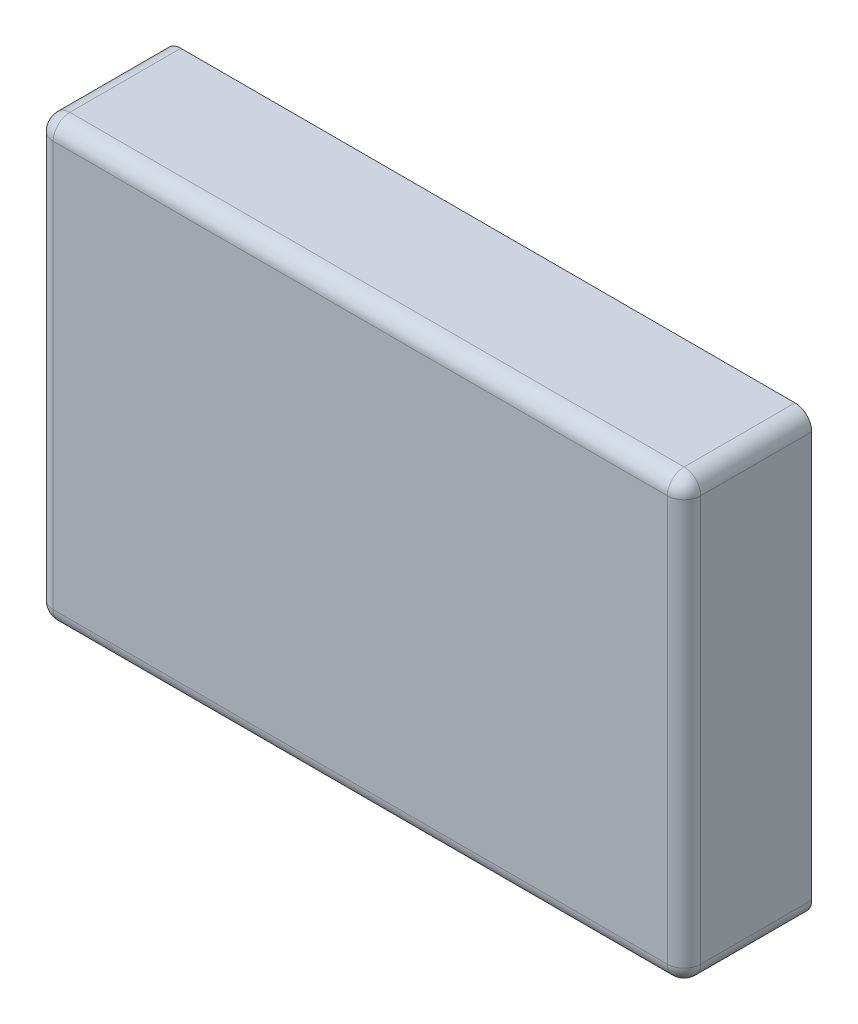
ISO-10303-21;
HEADER;
FILE_DESCRIPTION(('STEP AP214'),'2;1');
FILE_NAME('part.step','',(''),(''),'','','');
FILE_SCHEMA(('AUTOMOTIVE_DESIGN { 1 0 10303 214 1 1 1 1 }'));
ENDSEC;
DATA;
#1=APPLICATION_CONTEXT('core data for automotive mechanical design processes');
#2=APPLICATION_PROTOCOL_DEFINITION('international standard','automotive_design',2000,#1);
#3=PRODUCT_CONTEXT('',#1,'mechanical');
#4=PRODUCT('Part','Part','',(#3));
#5=PRODUCT_RELATED_PRODUCT_CATEGORY('part','',(#4));
#6=PRODUCT_DEFINITION_FORMATION('','',#4);
#7=PRODUCT_DEFINITION_CONTEXT('part definition',#1,'design');
#8=PRODUCT_DEFINITION('design','',#6,#7);
#9=PRODUCT_DEFINITION_SHAPE('','',#8);
#10=(LENGTH_UNIT() NAMED_UNIT(*) SI_UNIT(.MILLI.,.METRE.));
#11=(NAMED_UNIT(*) PLANE_ANGLE_UNIT() SI_UNIT($,.RADIAN.));
#12=(NAMED_UNIT(*) SI_UNIT($,.STERADIAN.) SOLID_ANGLE_UNIT());
#13=UNCERTAINTY_MEASURE_WITH_UNIT(LENGTH_MEASURE(1.E-05),#10,'distance_accuracy_value','');
#14=(GEOMETRIC_REPRESENTATION_CONTEXT(3) GLOBAL_UNCERTAINTY_ASSIGNED_CONTEXT((#13)) GLOBAL_UNIT_ASSIGNED_CONTEXT((#10,
#11,#12)) REPRESENTATION_CONTEXT('',''));
#15=CARTESIAN_POINT('',(0.,0.,0.));
#16=DIRECTION('',(0.,0.,1.));
#17=DIRECTION('',(1.,0.,0.));
#18=AXIS2_PLACEMENT_3D('',#15,#16,#17);
#19=CARTESIAN_POINT('',(0.,0.,9.7282));
#20=DIRECTION('',(1.,0.,0.));
#21=DIRECTION('',(0.,0.,-1.));
#22=AXIS2_PLACEMENT_3D('',#19,#20,#21);
#23=PLANE('',#22);
#24=DIRECTION('',(0.,-1.,0.));
#25=VECTOR('',#24,1.);
#26=CARTESIAN_POINT('',(0.,0.,0.));
#27=LINE('',#26,#25);
#28=CARTESIAN_POINT('',(0.,32.1818,0.));
#29=VERTEX_POINT('',#28);
#30=CARTESIAN_POINT('',(0.,1.27,0.));
#31=VERTEX_POINT('',#30);
#32=EDGE_CURVE('E198',#29,#31,#27,.T.);
#33=ORIENTED_EDGE('',*,*,#32,.T.);
#34=DIRECTION('',(0.,0.,-1.));
#35=VECTOR('',#34,1.);
#36=CARTESIAN_POINT('',(0.,1.27,9.7282));
#37=LINE('',#36,#35);
#38=CARTESIAN_POINT('',(0.,1.27,8.4582));
#39=VERTEX_POINT('',#38);
#40=EDGE_CURVE('E50',#31,#39,#37,.F.);
#41=ORIENTED_EDGE('',*,*,#40,.T.);
#42=DIRECTION('',(0.,-1.,0.));
#43=VECTOR('',#42,1.);
#44=CARTESIAN_POINT('',(0.,0.,8.4582));
#45=LINE('',#44,#43);
#46=CARTESIAN_POINT('',(0.,32.1818,8.4582));
#47=VERTEX_POINT('',#46);
#48=EDGE_CURVE('E55',#39,#47,#45,.F.);
#49=ORIENTED_EDGE('',*,*,#48,.T.);
#50=DIRECTION('',(0.,0.,-1.));
#51=VECTOR('',#50,1.);
#52=CARTESIAN_POINT('',(0.,32.1818,9.7282));
#53=LINE('',#52,#51);
#54=EDGE_CURVE('E167',#47,#29,#53,.T.);
#55=ORIENTED_EDGE('',*,*,#54,.T.);
#56=EDGE_LOOP('',(#33,#41,#49,#55));
#57=FACE_BOUND('',#56,.T.);
#58=ADVANCED_FACE('F33',(#57),#23,.F.);
#59=CARTESIAN_POINT('',(0.,0.,9.7282));
#60=DIRECTION('',(0.,1.,0.));
#61=DIRECTION('',(0.,0.,1.));
#62=AXIS2_PLACEMENT_3D('',#59,#60,#61);
#63=PLANE('',#62);
#64=DIRECTION('',(1.,0.,0.));
#65=VECTOR('',#64,1.);
#66=CARTESIAN_POINT('',(0.,0.,8.4582));
#67=LINE('',#66,#65);
#68=CARTESIAN_POINT('',(48.0822,0.,8.4582));
#69=VERTEX_POINT('',#68);
#70=CARTESIAN_POINT('',(1.27,0.,8.4582));
#71=VERTEX_POINT('',#70);
#72=EDGE_CURVE('E163',#69,#71,#67,.F.);
#73=ORIENTED_EDGE('',*,*,#72,.T.);
#74=DIRECTION('',(0.,0.,-1.));
#75=VECTOR('',#74,1.);
#76=CARTESIAN_POINT('',(1.27,0.,9.7282));
#77=LINE('',#76,#75);
#78=CARTESIAN_POINT('',(1.27,0.,0.));
#79=VERTEX_POINT('',#78);
#80=EDGE_CURVE('E165',#71,#79,#77,.T.);
#81=ORIENTED_EDGE('',*,*,#80,.T.);
#82=DIRECTION('',(1.,0.,0.));
#83=VECTOR('',#82,1.);
#84=CARTESIAN_POINT('',(0.,0.,0.));
#85=LINE('',#84,#83);
#86=CARTESIAN_POINT('',(48.0822,0.,0.));
#87=VERTEX_POINT('',#86);
#88=EDGE_CURVE('E200',#79,#87,#85,.T.);
#89=ORIENTED_EDGE('',*,*,#88,.T.);
#90=DIRECTION('',(0.,0.,-1.));
#91=VECTOR('',#90,1.);
#92=CARTESIAN_POINT('',(48.0822,0.,9.7282));
#93=LINE('',#92,#91);
#94=EDGE_CURVE('E161',#87,#69,#93,.F.);
#95=ORIENTED_EDGE('',*,*,#94,.T.);
#96=EDGE_LOOP('',(#73,#81,#89,#95));
#97=FACE_BOUND('',#96,.T.);
#98=ADVANCED_FACE('F252',(#97),#63,.F.);
#99=CARTESIAN_POINT('',(49.3522,0.,9.7282));
#100=DIRECTION('',(-1.,0.,0.));
#101=DIRECTION('',(0.,0.,1.));
#102=AXIS2_PLACEMENT_3D('',#99,#100,#101);
#103=PLANE('',#102);
#104=DIRECTION('',(0.,1.,0.));
#105=VECTOR('',#104,1.);
#106=CARTESIAN_POINT('',(49.3522,0.,8.4582));
#107=LINE('',#106,#105);
#108=CARTESIAN_POINT('',(49.3522,32.1818,8.4582));
#109=VERTEX_POINT('',#108);
#110=CARTESIAN_POINT('',(49.3522,1.27,8.4582));
#111=VERTEX_POINT('',#110);
#112=EDGE_CURVE('E157',#109,#111,#107,.F.);
#113=ORIENTED_EDGE('',*,*,#112,.T.);
#114=DIRECTION('',(0.,0.,-1.));
#115=VECTOR('',#114,1.);
#116=CARTESIAN_POINT('',(49.3522,1.27,9.7282));
#117=LINE('',#116,#115);
#118=CARTESIAN_POINT('',(49.3522,1.27,0.));
#119=VERTEX_POINT('',#118);
#120=EDGE_CURVE('E159',#111,#119,#117,.T.);
#121=ORIENTED_EDGE('',*,*,#120,.T.);
#122=DIRECTION('',(0.,1.,0.));
#123=VECTOR('',#122,1.);
#124=CARTESIAN_POINT('',(49.3522,0.,0.));
#125=LINE('',#124,#123);
#126=CARTESIAN_POINT('',(49.3522,32.1818,0.));
#127=VERTEX_POINT('',#126);
#128=EDGE_CURVE('E204',#119,#127,#125,.T.);
#129=ORIENTED_EDGE('',*,*,#128,.T.);
#130=DIRECTION('',(0.,0.,-1.));
#131=VECTOR('',#130,1.);
#132=CARTESIAN_POINT('',(49.3522,32.1818,9.7282));
#133=LINE('',#132,#131);
#134=EDGE_CURVE('E155',#127,#109,#133,.F.);
#135=ORIENTED_EDGE('',*,*,#134,.T.);
#136=EDGE_LOOP('',(#113,#121,#129,#135));
#137=FACE_BOUND('',#136,.T.);
#138=ADVANCED_FACE('F257',(#137),#103,.F.);
#139=CARTESIAN_POINT('',(0.,33.4518,9.7282));
#140=DIRECTION('',(0.,-1.,0.));
#141=DIRECTION('',(0.,0.,-1.));
#142=AXIS2_PLACEMENT_3D('',#139,#140,#141);
#143=PLANE('',#142);
#144=DIRECTION('',(-1.,0.,0.));
#145=VECTOR('',#144,1.);
#146=CARTESIAN_POINT('',(0.,33.4518,8.4582));
#147=LINE('',#146,#145);
#148=CARTESIAN_POINT('',(1.27,33.4518,8.4582));
#149=VERTEX_POINT('',#148);
#150=CARTESIAN_POINT('',(48.0822,33.4518,8.4582));
#151=VERTEX_POINT('',#150);
#152=EDGE_CURVE('E118',#149,#151,#147,.F.);
#153=ORIENTED_EDGE('',*,*,#152,.T.);
#154=DIRECTION('',(0.,0.,-1.));
#155=VECTOR('',#154,1.);
#156=CARTESIAN_POINT('',(48.0822,33.4518,9.7282));
#157=LINE('',#156,#155);
#158=CARTESIAN_POINT('',(48.0822,33.4518,0.));
#159=VERTEX_POINT('',#158);
#160=EDGE_CURVE('E153',#151,#159,#157,.T.);
#161=ORIENTED_EDGE('',*,*,#160,.T.);
#162=DIRECTION('',(-1.,0.,0.));
#163=VECTOR('',#162,1.);
#164=CARTESIAN_POINT('',(0.,33.4518,0.));
#165=LINE('',#164,#163);
#166=CARTESIAN_POINT('',(1.27,33.4518,0.));
#167=VERTEX_POINT('',#166);
#168=EDGE_CURVE('E140',#159,#167,#165,.T.);
#169=ORIENTED_EDGE('',*,*,#168,.T.);
#170=DIRECTION('',(0.,0.,-1.));
#171=VECTOR('',#170,1.);
#172=CARTESIAN_POINT('',(1.27,33.4518,9.7282));
#173=LINE('',#172,#171);
#174=EDGE_CURVE('E146',#167,#149,#173,.F.);
#175=ORIENTED_EDGE('',*,*,#174,.T.);
#176=EDGE_LOOP('',(#153,#161,#169,#175));
#177=FACE_BOUND('',#176,.T.);
#178=ADVANCED_FACE('F229',(#177),#143,.F.);
#179=CARTESIAN_POINT('',(0.,0.,9.7282));
#180=DIRECTION('',(0.,0.,-1.));
#181=DIRECTION('',(-1.,0.,0.));
#182=AXIS2_PLACEMENT_3D('',#179,#180,#181);
#183=PLANE('',#182);
#184=DIRECTION('',(0.,1.,0.));
#185=VECTOR('',#184,1.);
#186=CARTESIAN_POINT('',(48.0822,0.,9.7282));
#187=LINE('',#186,#185);
#188=CARTESIAN_POINT('',(48.0822,1.27,9.7282));
#189=VERTEX_POINT('',#188);
#190=CARTESIAN_POINT('',(48.0822,32.1818,9.7282));
#191=VERTEX_POINT('',#190);
#192=EDGE_CURVE('E144',#189,#191,#187,.T.);
#193=ORIENTED_EDGE('',*,*,#192,.T.);
#194=DIRECTION('',(-1.,0.,0.));
#195=VECTOR('',#194,1.);
#196=CARTESIAN_POINT('',(0.,32.1818,9.7282));
#197=LINE('',#196,#195);
#198=CARTESIAN_POINT('',(1.27,32.1818,9.7282));
#199=VERTEX_POINT('',#198);
#200=EDGE_CURVE('E116',#191,#199,#197,.T.);
#201=ORIENTED_EDGE('',*,*,#200,.T.);
#202=DIRECTION('',(0.,-1.,0.));
#203=VECTOR('',#202,1.);
#204=CARTESIAN_POINT('',(1.27,0.,9.7282));
#205=LINE('',#204,#203);
#206=CARTESIAN_POINT('',(1.27,1.27,9.7282));
#207=VERTEX_POINT('',#206);
#208=EDGE_CURVE('E133',#199,#207,#205,.T.);
#209=ORIENTED_EDGE('',*,*,#208,.T.);
#210=DIRECTION('',(1.,0.,0.));
#211=VECTOR('',#210,1.);
#212=CARTESIAN_POINT('',(0.,1.27,9.7282));
#213=LINE('',#212,#211);
#214=EDGE_CURVE('E139',#207,#189,#213,.T.);
#215=ORIENTED_EDGE('',*,*,#214,.T.);
#216=EDGE_LOOP('',(#193,#201,#209,#215));
#217=FACE_BOUND('',#216,.T.);
#218=ADVANCED_FACE('F142',(#217),#183,.F.);
#219=CARTESIAN_POINT('',(0.,0.,0.));
#220=DIRECTION('',(0.,0.,-1.));
#221=DIRECTION('',(-1.,0.,0.));
#222=AXIS2_PLACEMENT_3D('',#219,#220,#221);
#223=PLANE('',#222);
#224=ORIENTED_EDGE('',*,*,#88,.F.);
#225=CARTESIAN_POINT('',(1.27,1.27,0.));
#226=DIRECTION('',(0.,0.,-1.));
#227=DIRECTION('',(-1.,0.,0.));
#228=AXIS2_PLACEMENT_3D('',#225,#226,#227);
#229=CIRCLE('',#228,1.27);
#230=EDGE_CURVE('E11',#79,#31,#229,.T.);
#231=ORIENTED_EDGE('',*,*,#230,.T.);
#232=ORIENTED_EDGE('',*,*,#32,.F.);
#233=CARTESIAN_POINT('',(1.27,32.1818,0.));
#234=DIRECTION('',(0.,0.,-1.));
#235=DIRECTION('',(-1.,0.,0.));
#236=AXIS2_PLACEMENT_3D('',#233,#234,#235);
#237=CIRCLE('',#236,1.27);
#238=EDGE_CURVE('E171',#29,#167,#237,.T.);
#239=ORIENTED_EDGE('',*,*,#238,.T.);
#240=ORIENTED_EDGE('',*,*,#168,.F.);
#241=CARTESIAN_POINT('',(48.0822,32.1818,0.));
#242=DIRECTION('',(0.,0.,-1.));
#243=DIRECTION('',(-1.,0.,0.));
#244=AXIS2_PLACEMENT_3D('',#241,#242,#243);
#245=CIRCLE('',#244,1.27);
#246=EDGE_CURVE('E173',#159,#127,#245,.T.);
#247=ORIENTED_EDGE('',*,*,#246,.T.);
#248=ORIENTED_EDGE('',*,*,#128,.F.);
#249=CARTESIAN_POINT('',(48.0822,1.27,0.));
#250=DIRECTION('',(0.,0.,-1.));
#251=DIRECTION('',(-1.,0.,0.));
#252=AXIS2_PLACEMENT_3D('',#249,#250,#251);
#253=CIRCLE('',#252,1.27);
#254=EDGE_CURVE('E42',#119,#87,#253,.T.);
#255=ORIENTED_EDGE('',*,*,#254,.T.);
#256=EDGE_LOOP('',(#224,#231,#232,#239,#240,#247,#248,#255));
#257=FACE_BOUND('',#256,.T.);
#258=ADVANCED_FACE('F236',(#257),#223,.T.);
#259=CARTESIAN_POINT('',(48.0822,1.27,9.7282));
#260=DIRECTION('',(0.,0.,-1.));
#261=DIRECTION('',(-1.,0.,0.));
#262=AXIS2_PLACEMENT_3D('',#259,#260,#261);
#263=CYLINDRICAL_SURFACE('',#262,1.27);
#264=ORIENTED_EDGE('',*,*,#254,.F.);
#265=ORIENTED_EDGE('',*,*,#120,.F.);
#266=CARTESIAN_POINT('',(48.0822,1.27,8.4582));
#267=DIRECTION('',(0.,0.,1.));
#268=DIRECTION('',(1.,0.,0.));
#269=AXIS2_PLACEMENT_3D('',#266,#267,#268);
#270=CIRCLE('',#269,1.27);
#271=EDGE_CURVE('E37',#69,#111,#270,.T.);
#272=ORIENTED_EDGE('',*,*,#271,.F.);
#273=ORIENTED_EDGE('',*,*,#94,.F.);
#274=EDGE_LOOP('',(#264,#265,#272,#273));
#275=FACE_BOUND('',#274,.T.);
#276=ADVANCED_FACE('F35',(#275),#263,.T.);
#277=CARTESIAN_POINT('',(0.,1.27,8.4582));
#278=DIRECTION('',(1.,0.,0.));
#279=DIRECTION('',(0.,0.,-1.));
#280=AXIS2_PLACEMENT_3D('',#277,#278,#279);
#281=CYLINDRICAL_SURFACE('',#280,1.27);
#282=CARTESIAN_POINT('',(1.27,1.27,8.4582));
#283=DIRECTION('',(-1.,0.,0.));
#284=DIRECTION('',(0.,0.,1.));
#285=AXIS2_PLACEMENT_3D('',#282,#283,#284);
#286=CIRCLE('',#285,1.27);
#287=EDGE_CURVE('E190',#71,#207,#286,.T.);
#288=ORIENTED_EDGE('',*,*,#287,.F.);
#289=ORIENTED_EDGE('',*,*,#72,.F.);
#290=CARTESIAN_POINT('',(48.0822,1.27,8.4582));
#291=DIRECTION('',(1.,0.,0.));
#292=DIRECTION('',(0.,0.,-1.));
#293=AXIS2_PLACEMENT_3D('',#290,#291,#292);
#294=CIRCLE('',#293,1.27);
#295=EDGE_CURVE('E192',#189,#69,#294,.T.);
#296=ORIENTED_EDGE('',*,*,#295,.F.);
#297=ORIENTED_EDGE('',*,*,#214,.F.);
#298=EDGE_LOOP('',(#288,#289,#296,#297));
#299=FACE_BOUND('',#298,.T.);
#300=ADVANCED_FACE('F213',(#299),#281,.T.);
#301=CARTESIAN_POINT('',(1.27,1.27,9.7282));
#302=DIRECTION('',(0.,0.,-1.));
#303=DIRECTION('',(-1.,0.,0.));
#304=AXIS2_PLACEMENT_3D('',#301,#302,#303);
#305=CYLINDRICAL_SURFACE('',#304,1.27);
#306=ORIENTED_EDGE('',*,*,#230,.F.);
#307=ORIENTED_EDGE('',*,*,#80,.F.);
#308=CARTESIAN_POINT('',(1.27,1.27,8.4582));
#309=DIRECTION('',(0.,0.,1.));
#310=DIRECTION('',(1.,0.,0.));
#311=AXIS2_PLACEMENT_3D('',#308,#309,#310);
#312=CIRCLE('',#311,1.27);
#313=EDGE_CURVE('E187',#39,#71,#312,.T.);
#314=ORIENTED_EDGE('',*,*,#313,.F.);
#315=ORIENTED_EDGE('',*,*,#40,.F.);
#316=EDGE_LOOP('',(#306,#307,#314,#315));
#317=FACE_BOUND('',#316,.T.);
#318=ADVANCED_FACE('F240',(#317),#305,.T.);
#319=CARTESIAN_POINT('',(48.0822,1.27,8.4582));
#320=DIRECTION('',(0.,0.,1.));
#321=DIRECTION('',(1.,0.,0.));
#322=AXIS2_PLACEMENT_3D('',#319,#320,#321);
#323=SPHERICAL_SURFACE('',#322,1.27);
#324=ORIENTED_EDGE('',*,*,#295,.T.);
#325=ORIENTED_EDGE('',*,*,#271,.T.);
#326=CARTESIAN_POINT('',(48.0822,1.27,8.4582));
#327=DIRECTION('',(0.,-1.,0.));
#328=DIRECTION('',(0.,0.,-1.));
#329=AXIS2_PLACEMENT_3D('',#326,#327,#328);
#330=CIRCLE('',#329,1.27);
#331=EDGE_CURVE('E184',#189,#111,#330,.F.);
#332=ORIENTED_EDGE('',*,*,#331,.F.);
#333=EDGE_LOOP('',(#324,#325,#332));
#334=FACE_BOUND('',#333,.T.);
#335=ADVANCED_FACE('F214',(#334),#323,.T.);
#336=CARTESIAN_POINT('',(1.27,1.27,8.4582));
#337=DIRECTION('',(0.,0.,1.));
#338=DIRECTION('',(1.,0.,0.));
#339=AXIS2_PLACEMENT_3D('',#336,#337,#338);
#340=SPHERICAL_SURFACE('',#339,1.27);
#341=ORIENTED_EDGE('',*,*,#313,.T.);
#342=ORIENTED_EDGE('',*,*,#287,.T.);
#343=CARTESIAN_POINT('',(1.27,1.27,8.4582));
#344=DIRECTION('',(0.,-1.,0.));
#345=DIRECTION('',(0.,0.,-1.));
#346=AXIS2_PLACEMENT_3D('',#343,#344,#345);
#347=CIRCLE('',#346,1.27);
#348=EDGE_CURVE('E136',#39,#207,#347,.F.);
#349=ORIENTED_EDGE('',*,*,#348,.F.);
#350=EDGE_LOOP('',(#341,#342,#349));
#351=FACE_BOUND('',#350,.T.);
#352=ADVANCED_FACE('F242',(#351),#340,.T.);
#353=CARTESIAN_POINT('',(48.0822,32.1818,9.7282));
#354=DIRECTION('',(0.,0.,-1.));
#355=DIRECTION('',(-1.,0.,0.));
#356=AXIS2_PLACEMENT_3D('',#353,#354,#355);
#357=CYLINDRICAL_SURFACE('',#356,1.27);
#358=ORIENTED_EDGE('',*,*,#246,.F.);
#359=ORIENTED_EDGE('',*,*,#160,.F.);
#360=CARTESIAN_POINT('',(48.0822,32.1818,8.4582));
#361=DIRECTION('',(0.,0.,1.));
#362=DIRECTION('',(1.,0.,0.));
#363=AXIS2_PLACEMENT_3D('',#360,#361,#362);
#364=CIRCLE('',#363,1.27);
#365=EDGE_CURVE('E180',#109,#151,#364,.T.);
#366=ORIENTED_EDGE('',*,*,#365,.F.);
#367=ORIENTED_EDGE('',*,*,#134,.F.);
#368=EDGE_LOOP('',(#358,#359,#366,#367));
#369=FACE_BOUND('',#368,.T.);
#370=ADVANCED_FACE('F226',(#369),#357,.T.);
#371=CARTESIAN_POINT('',(48.0822,0.,8.4582));
#372=DIRECTION('',(0.,1.,0.));
#373=DIRECTION('',(0.,0.,1.));
#374=AXIS2_PLACEMENT_3D('',#371,#372,#373);
#375=CYLINDRICAL_SURFACE('',#374,1.27);
#376=ORIENTED_EDGE('',*,*,#331,.T.);
#377=ORIENTED_EDGE('',*,*,#112,.F.);
#378=CARTESIAN_POINT('',(48.0822,32.1818,8.4582));
#379=DIRECTION('',(0.,1.,0.));
#380=DIRECTION('',(0.,0.,1.));
#381=AXIS2_PLACEMENT_3D('',#378,#379,#380);
#382=CIRCLE('',#381,1.27);
#383=EDGE_CURVE('E130',#191,#109,#382,.T.);
#384=ORIENTED_EDGE('',*,*,#383,.F.);
#385=ORIENTED_EDGE('',*,*,#192,.F.);
#386=EDGE_LOOP('',(#376,#377,#384,#385));
#387=FACE_BOUND('',#386,.T.);
#388=ADVANCED_FACE('F217',(#387),#375,.T.);
#389=CARTESIAN_POINT('',(1.27,0.,8.4582));
#390=DIRECTION('',(0.,-1.,0.));
#391=DIRECTION('',(0.,0.,-1.));
#392=AXIS2_PLACEMENT_3D('',#389,#390,#391);
#393=CYLINDRICAL_SURFACE('',#392,1.27);
#394=ORIENTED_EDGE('',*,*,#348,.T.);
#395=ORIENTED_EDGE('',*,*,#208,.F.);
#396=CARTESIAN_POINT('',(1.27,32.1818,8.4582));
#397=DIRECTION('',(0.,1.,0.));
#398=DIRECTION('',(0.,0.,1.));
#399=AXIS2_PLACEMENT_3D('',#396,#397,#398);
#400=CIRCLE('',#399,1.27);
#401=EDGE_CURVE('E124',#47,#199,#400,.T.);
#402=ORIENTED_EDGE('',*,*,#401,.F.);
#403=ORIENTED_EDGE('',*,*,#48,.F.);
#404=EDGE_LOOP('',(#394,#395,#402,#403));
#405=FACE_BOUND('',#404,.T.);
#406=ADVANCED_FACE('F134',(#405),#393,.T.);
#407=CARTESIAN_POINT('',(1.27,32.1818,9.7282));
#408=DIRECTION('',(0.,0.,-1.));
#409=DIRECTION('',(-1.,0.,0.));
#410=AXIS2_PLACEMENT_3D('',#407,#408,#409);
#411=CYLINDRICAL_SURFACE('',#410,1.27);
#412=ORIENTED_EDGE('',*,*,#238,.F.);
#413=ORIENTED_EDGE('',*,*,#54,.F.);
#414=CARTESIAN_POINT('',(1.27,32.1818,8.4582));
#415=DIRECTION('',(0.,0.,1.));
#416=DIRECTION('',(1.,0.,0.));
#417=AXIS2_PLACEMENT_3D('',#414,#415,#416);
#418=CIRCLE('',#417,1.27);
#419=EDGE_CURVE('E128',#149,#47,#418,.T.);
#420=ORIENTED_EDGE('',*,*,#419,.F.);
#421=ORIENTED_EDGE('',*,*,#174,.F.);
#422=EDGE_LOOP('',(#412,#413,#420,#421));
#423=FACE_BOUND('',#422,.T.);
#424=ADVANCED_FACE('F233',(#423),#411,.T.);
#425=CARTESIAN_POINT('',(48.0822,32.1818,8.4582));
#426=DIRECTION('',(0.,0.,1.));
#427=DIRECTION('',(1.,0.,0.));
#428=AXIS2_PLACEMENT_3D('',#425,#426,#427);
#429=SPHERICAL_SURFACE('',#428,1.27);
#430=ORIENTED_EDGE('',*,*,#383,.T.);
#431=ORIENTED_EDGE('',*,*,#365,.T.);
#432=CARTESIAN_POINT('',(48.0822,32.1818,8.4582));
#433=DIRECTION('',(1.,0.,0.));
#434=DIRECTION('',(0.,0.,-1.));
#435=AXIS2_PLACEMENT_3D('',#432,#433,#434);
#436=CIRCLE('',#435,1.27);
#437=EDGE_CURVE('E121',#191,#151,#436,.F.);
#438=ORIENTED_EDGE('',*,*,#437,.F.);
#439=EDGE_LOOP('',(#430,#431,#438));
#440=FACE_BOUND('',#439,.T.);
#441=ADVANCED_FACE('F221',(#440),#429,.T.);
#442=CARTESIAN_POINT('',(1.27,32.1818,8.4582));
#443=DIRECTION('',(0.,0.,1.));
#444=DIRECTION('',(1.,0.,0.));
#445=AXIS2_PLACEMENT_3D('',#442,#443,#444);
#446=SPHERICAL_SURFACE('',#445,1.27);
#447=ORIENTED_EDGE('',*,*,#419,.T.);
#448=ORIENTED_EDGE('',*,*,#401,.T.);
#449=CARTESIAN_POINT('',(1.27,32.1818,8.4582));
#450=DIRECTION('',(-1.,0.,0.));
#451=DIRECTION('',(0.,0.,1.));
#452=AXIS2_PLACEMENT_3D('',#449,#450,#451);
#453=CIRCLE('',#452,1.27);
#454=EDGE_CURVE('E112',#149,#199,#453,.F.);
#455=ORIENTED_EDGE('',*,*,#454,.F.);
#456=EDGE_LOOP('',(#447,#448,#455));
#457=FACE_BOUND('',#456,.T.);
#458=ADVANCED_FACE('F126',(#457),#446,.T.);
#459=CARTESIAN_POINT('',(0.,32.1818,8.4582));
#460=DIRECTION('',(-1.,0.,0.));
#461=DIRECTION('',(0.,0.,1.));
#462=AXIS2_PLACEMENT_3D('',#459,#460,#461);
#463=CYLINDRICAL_SURFACE('',#462,1.27);
#464=ORIENTED_EDGE('',*,*,#437,.T.);
#465=ORIENTED_EDGE('',*,*,#152,.F.);
#466=ORIENTED_EDGE('',*,*,#454,.T.);
#467=ORIENTED_EDGE('',*,*,#200,.F.);
#468=EDGE_LOOP('',(#464,#465,#466,#467));
#469=FACE_BOUND('',#468,.T.);
#470=ADVANCED_FACE('F114',(#469),#463,.T.);
#471=CLOSED_SHELL('',(#58,#98,#138,#178,#218,#258,#276,#300,#318,#335,#352,#370,#388,#406,#424,
#441,#458,#470));
#472=MANIFOLD_SOLID_BREP('B2',#471);
#473=ADVANCED_BREP_SHAPE_REPRESENTATION('',(#18,#472),#14);
#474=SHAPE_DEFINITION_REPRESENTATION(#9,#473);
ENDSEC;
END-ISO-10303-21;
